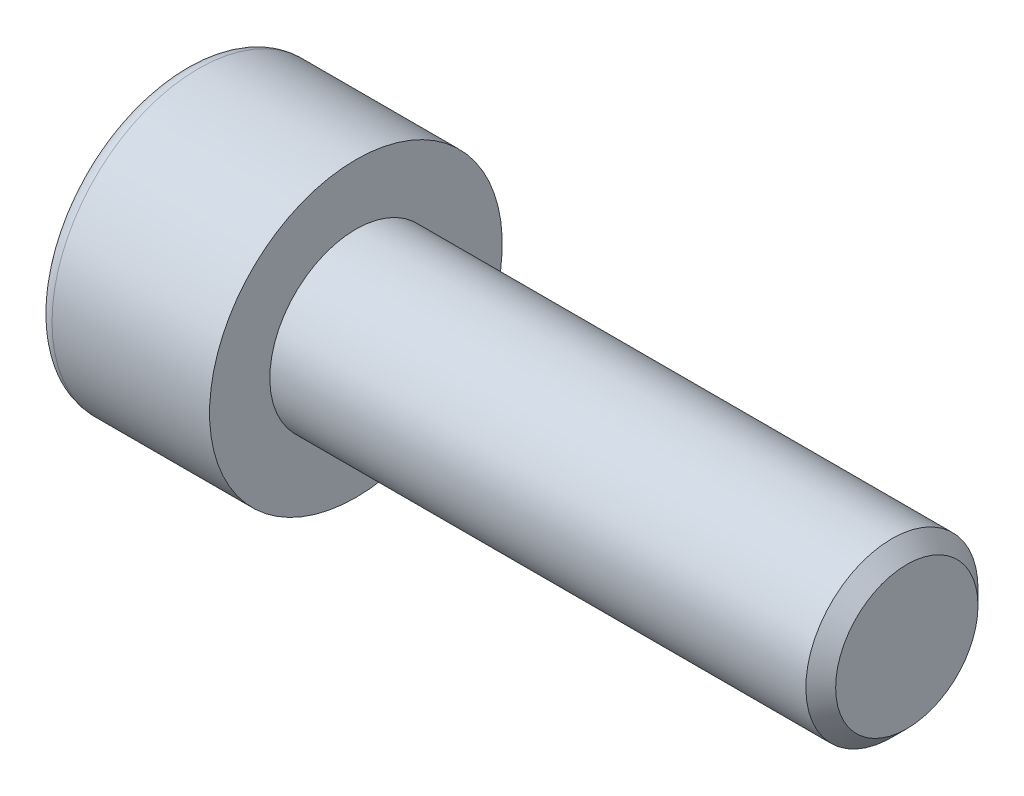
ISO-10303-21;
HEADER;
FILE_DESCRIPTION(('STEP AP214'),'2;1');
FILE_NAME('part.step','',(''),(''),'','','');
FILE_SCHEMA(('AUTOMOTIVE_DESIGN { 1 0 10303 214 1 1 1 1 }'));
ENDSEC;
DATA;
#1=APPLICATION_CONTEXT('core data for automotive mechanical design processes');
#2=APPLICATION_PROTOCOL_DEFINITION('international standard','automotive_design',2000,#1);
#3=PRODUCT_CONTEXT('',#1,'mechanical');
#4=PRODUCT('Part','Part','',(#3));
#5=PRODUCT_RELATED_PRODUCT_CATEGORY('part','',(#4));
#6=PRODUCT_DEFINITION_FORMATION('','',#4);
#7=PRODUCT_DEFINITION_CONTEXT('part definition',#1,'design');
#8=PRODUCT_DEFINITION('design','',#6,#7);
#9=PRODUCT_DEFINITION_SHAPE('','',#8);
#10=(LENGTH_UNIT() NAMED_UNIT(*) SI_UNIT(.MILLI.,.METRE.));
#11=(NAMED_UNIT(*) PLANE_ANGLE_UNIT() SI_UNIT($,.RADIAN.));
#12=(NAMED_UNIT(*) SI_UNIT($,.STERADIAN.) SOLID_ANGLE_UNIT());
#13=UNCERTAINTY_MEASURE_WITH_UNIT(LENGTH_MEASURE(1.E-05),#10,'distance_accuracy_value','');
#14=(GEOMETRIC_REPRESENTATION_CONTEXT(3) GLOBAL_UNCERTAINTY_ASSIGNED_CONTEXT((#13)) GLOBAL_UNIT_ASSIGNED_CONTEXT((#10,
#11,#12)) REPRESENTATION_CONTEXT('',''));
#15=CARTESIAN_POINT('',(0.,0.,0.));
#16=DIRECTION('',(0.,0.,1.));
#17=DIRECTION('',(1.,0.,0.));
#18=AXIS2_PLACEMENT_3D('',#15,#16,#17);
#19=CARTESIAN_POINT('',(-2.2875,0.,0.));
#20=DIRECTION('',(-1.,0.,0.));
#21=DIRECTION('',(0.,1.,0.));
#22=AXIS2_PLACEMENT_3D('',#19,#20,#21);
#23=CYLINDRICAL_SURFACE('',#22,4.25);
#24=CARTESIAN_POINT('',(-4.575,0.,0.));
#25=DIRECTION('',(-1.,0.,0.));
#26=DIRECTION('',(0.,0.,1.));
#27=AXIS2_PLACEMENT_3D('',#24,#25,#26);
#28=CIRCLE('',#27,4.25);
#29=CARTESIAN_POINT('',(-4.575,0.,4.25));
#30=VERTEX_POINT('',#29);
#31=EDGE_CURVE('E11',#30,#30,#28,.T.);
#32=ORIENTED_EDGE('',*,*,#31,.F.);
#33=EDGE_LOOP('',(#32));
#34=FACE_BOUND('',#33,.T.);
#35=CARTESIAN_POINT('',(0.,0.,0.));
#36=DIRECTION('',(1.,0.,0.));
#37=DIRECTION('',(0.,1.,0.));
#38=AXIS2_PLACEMENT_3D('',#35,#36,#37);
#39=CIRCLE('',#38,4.25);
#40=CARTESIAN_POINT('',(0.,4.25,0.));
#41=VERTEX_POINT('',#40);
#42=EDGE_CURVE('E99',#41,#41,#39,.T.);
#43=ORIENTED_EDGE('',*,*,#42,.F.);
#44=EDGE_LOOP('',(#43));
#45=FACE_BOUND('',#44,.T.);
#46=ADVANCED_FACE('F17',(#34,#45),#23,.T.);
#47=CARTESIAN_POINT('',(-4.575,0.,0.));
#48=DIRECTION('',(1.,0.,0.));
#49=DIRECTION('',(0.,0.,-1.));
#50=AXIS2_PLACEMENT_3D('',#47,#48,#49);
#51=TOROIDAL_SURFACE('',#50,3.825,0.425);
#52=CARTESIAN_POINT('',(-5.,0.,0.));
#53=DIRECTION('',(-1.,0.,0.));
#54=DIRECTION('',(0.,1.,0.));
#55=AXIS2_PLACEMENT_3D('',#52,#53,#54);
#56=CIRCLE('',#55,3.825);
#57=CARTESIAN_POINT('',(-5.,3.825,0.));
#58=VERTEX_POINT('',#57);
#59=EDGE_CURVE('E27',#58,#58,#56,.T.);
#60=ORIENTED_EDGE('',*,*,#59,.F.);
#61=EDGE_LOOP('',(#60));
#62=FACE_BOUND('',#61,.T.);
#63=ORIENTED_EDGE('',*,*,#31,.T.);
#64=EDGE_LOOP('',(#63));
#65=FACE_BOUND('',#64,.T.);
#66=ADVANCED_FACE('F120',(#62,#65),#51,.T.);
#67=CARTESIAN_POINT('',(-5.,1.9125,0.));
#68=DIRECTION('',(-1.,0.,0.));
#69=DIRECTION('',(0.,-1.,0.));
#70=AXIS2_PLACEMENT_3D('',#67,#68,#69);
#71=PLANE('',#70);
#72=ORIENTED_EDGE('',*,*,#59,.T.);
#73=EDGE_LOOP('',(#72));
#74=FACE_BOUND('',#73,.T.);
#75=DIRECTION('',(0.,0.500000000000017,-0.866025403784429));
#76=VECTOR('',#75,1.);
#77=CARTESIAN_POINT('',(-5.,-2.309401076758,0.));
#78=LINE('',#77,#76);
#79=CARTESIAN_POINT('',(-5.,-2.309401076758,0.));
#80=VERTEX_POINT('',#79);
#81=CARTESIAN_POINT('',(-5.,-1.154700538379,-2.));
#82=VERTEX_POINT('',#81);
#83=EDGE_CURVE('E170',#80,#82,#78,.T.);
#84=ORIENTED_EDGE('',*,*,#83,.T.);
#85=DIRECTION('',(0.,-1.,0.));
#86=VECTOR('',#85,1.);
#87=CARTESIAN_POINT('',(-5.,1.154700538379,-2.));
#88=LINE('',#87,#86);
#89=CARTESIAN_POINT('',(-5.,1.154700538379,-2.));
#90=VERTEX_POINT('',#89);
#91=EDGE_CURVE('E36',#90,#82,#88,.T.);
#92=ORIENTED_EDGE('',*,*,#91,.F.);
#93=DIRECTION('',(0.,0.500000000000017,0.866025403784429));
#94=VECTOR('',#93,1.);
#95=CARTESIAN_POINT('',(-5.,1.154700538379,-2.));
#96=LINE('',#95,#94);
#97=CARTESIAN_POINT('',(-5.,2.309401076758,0.));
#98=VERTEX_POINT('',#97);
#99=EDGE_CURVE('E172',#90,#98,#96,.T.);
#100=ORIENTED_EDGE('',*,*,#99,.T.);
#101=DIRECTION('',(0.,-0.500000000000017,0.866025403784429));
#102=VECTOR('',#101,1.);
#103=CARTESIAN_POINT('',(-5.,2.309401076758,0.));
#104=LINE('',#103,#102);
#105=CARTESIAN_POINT('',(-5.,1.154700538379,2.));
#106=VERTEX_POINT('',#105);
#107=EDGE_CURVE('E177',#98,#106,#104,.T.);
#108=ORIENTED_EDGE('',*,*,#107,.T.);
#109=DIRECTION('',(0.,1.,0.));
#110=VECTOR('',#109,1.);
#111=CARTESIAN_POINT('',(-5.,-1.154700538379,2.));
#112=LINE('',#111,#110);
#113=CARTESIAN_POINT('',(-5.,-1.154700538379,2.));
#114=VERTEX_POINT('',#113);
#115=EDGE_CURVE('E80',#114,#106,#112,.T.);
#116=ORIENTED_EDGE('',*,*,#115,.F.);
#117=DIRECTION('',(0.,-0.500000000000017,-0.866025403784429));
#118=VECTOR('',#117,1.);
#119=CARTESIAN_POINT('',(-5.,-1.154700538379,2.));
#120=LINE('',#119,#118);
#121=EDGE_CURVE('E179',#114,#80,#120,.T.);
#122=ORIENTED_EDGE('',*,*,#121,.T.);
#123=EDGE_LOOP('',(#84,#92,#100,#108,#116,#122));
#124=FACE_BOUND('',#123,.T.);
#125=ADVANCED_FACE('F126',(#74,#124),#71,.T.);
#126=CARTESIAN_POINT('',(-6.,-2.309401076758,0.));
#127=DIRECTION('',(0.,-0.866025403784429,0.500000000000017));
#128=DIRECTION('',(0.,-0.500000000000017,-0.866025403784429));
#129=AXIS2_PLACEMENT_3D('',#126,#127,#128);
#130=PLANE('',#129);
#131=DIRECTION('',(-1.,0.,0.));
#132=VECTOR('',#131,1.);
#133=CARTESIAN_POINT('',(-2.5,-1.154700538379,2.));
#134=LINE('',#133,#132);
#135=CARTESIAN_POINT('',(-2.5,-1.154700538379,2.));
#136=VERTEX_POINT('',#135);
#137=EDGE_CURVE('E93',#136,#114,#134,.T.);
#138=ORIENTED_EDGE('',*,*,#137,.F.);
#139=DIRECTION('',(0.,0.500000000000017,0.866025403784429));
#140=VECTOR('',#139,1.);
#141=CARTESIAN_POINT('',(-2.5,-2.309401076759,0.));
#142=LINE('',#141,#140);
#143=CARTESIAN_POINT('',(-2.5,-2.309401076759,0.));
#144=VERTEX_POINT('',#143);
#145=EDGE_CURVE('E91',#144,#136,#142,.T.);
#146=ORIENTED_EDGE('',*,*,#145,.F.);
#147=DIRECTION('',(-1.,0.,0.));
#148=VECTOR('',#147,1.);
#149=CARTESIAN_POINT('',(-2.5,-2.309401076759,0.));
#150=LINE('',#149,#148);
#151=EDGE_CURVE('E182',#144,#80,#150,.T.);
#152=ORIENTED_EDGE('',*,*,#151,.T.);
#153=ORIENTED_EDGE('',*,*,#121,.F.);
#154=EDGE_LOOP('',(#138,#146,#152,#153));
#155=FACE_BOUND('',#154,.T.);
#156=ADVANCED_FACE('F134',(#155),#130,.F.);
#157=CARTESIAN_POINT('',(-6.,-1.154700538379,-2.));
#158=DIRECTION('',(0.,-0.866025403784429,-0.500000000000017));
#159=DIRECTION('',(0.,0.500000000000017,-0.866025403784429));
#160=AXIS2_PLACEMENT_3D('',#157,#158,#159);
#161=PLANE('',#160);
#162=ORIENTED_EDGE('',*,*,#151,.F.);
#163=DIRECTION('',(0.,-0.500000000000017,0.866025403784429));
#164=VECTOR('',#163,1.);
#165=CARTESIAN_POINT('',(-2.5,-1.154700538379,-2.));
#166=LINE('',#165,#164);
#167=CARTESIAN_POINT('',(-2.5,-1.154700538379,-2.));
#168=VERTEX_POINT('',#167);
#169=EDGE_CURVE('E165',#168,#144,#166,.T.);
#170=ORIENTED_EDGE('',*,*,#169,.F.);
#171=DIRECTION('',(-1.,0.,0.));
#172=VECTOR('',#171,1.);
#173=CARTESIAN_POINT('',(-2.5,-1.154700538379,-2.));
#174=LINE('',#173,#172);
#175=EDGE_CURVE('E186',#168,#82,#174,.T.);
#176=ORIENTED_EDGE('',*,*,#175,.T.);
#177=ORIENTED_EDGE('',*,*,#83,.F.);
#178=EDGE_LOOP('',(#162,#170,#176,#177));
#179=FACE_BOUND('',#178,.T.);
#180=ADVANCED_FACE('F138',(#179),#161,.F.);
#181=CARTESIAN_POINT('',(-6.,1.154700538379,-2.));
#182=DIRECTION('',(0.,0.,-1.));
#183=DIRECTION('',(0.,1.,0.));
#184=AXIS2_PLACEMENT_3D('',#181,#182,#183);
#185=PLANE('',#184);
#186=ORIENTED_EDGE('',*,*,#175,.F.);
#187=DIRECTION('',(0.,1.,0.));
#188=VECTOR('',#187,1.);
#189=CARTESIAN_POINT('',(-2.5,-1.154700538379,-2.));
#190=LINE('',#189,#188);
#191=CARTESIAN_POINT('',(-2.5,1.154700538379,-2.));
#192=VERTEX_POINT('',#191);
#193=EDGE_CURVE('E190',#168,#192,#190,.T.);
#194=ORIENTED_EDGE('',*,*,#193,.T.);
#195=DIRECTION('',(-1.,0.,0.));
#196=VECTOR('',#195,1.);
#197=CARTESIAN_POINT('',(-2.5,1.154700538379,-2.));
#198=LINE('',#197,#196);
#199=EDGE_CURVE('E174',#192,#90,#198,.T.);
#200=ORIENTED_EDGE('',*,*,#199,.T.);
#201=ORIENTED_EDGE('',*,*,#91,.T.);
#202=EDGE_LOOP('',(#186,#194,#200,#201));
#203=FACE_BOUND('',#202,.T.);
#204=ADVANCED_FACE('F142',(#203),#185,.F.);
#205=CARTESIAN_POINT('',(-6.,2.309401076758,0.));
#206=DIRECTION('',(0.,0.866025403784429,-0.500000000000017));
#207=DIRECTION('',(0.,0.500000000000017,0.866025403784429));
#208=AXIS2_PLACEMENT_3D('',#205,#206,#207);
#209=PLANE('',#208);
#210=ORIENTED_EDGE('',*,*,#199,.F.);
#211=DIRECTION('',(0.,-0.500000000000017,-0.866025403784429));
#212=VECTOR('',#211,1.);
#213=CARTESIAN_POINT('',(-2.5,2.309401076759,0.));
#214=LINE('',#213,#212);
#215=CARTESIAN_POINT('',(-2.5,2.309401076759,0.));
#216=VERTEX_POINT('',#215);
#217=EDGE_CURVE('E67',#216,#192,#214,.T.);
#218=ORIENTED_EDGE('',*,*,#217,.F.);
#219=DIRECTION('',(-1.,0.,0.));
#220=VECTOR('',#219,1.);
#221=CARTESIAN_POINT('',(-2.5,2.309401076759,0.));
#222=LINE('',#221,#220);
#223=EDGE_CURVE('E77',#216,#98,#222,.T.);
#224=ORIENTED_EDGE('',*,*,#223,.T.);
#225=ORIENTED_EDGE('',*,*,#99,.F.);
#226=EDGE_LOOP('',(#210,#218,#224,#225));
#227=FACE_BOUND('',#226,.T.);
#228=ADVANCED_FACE('F146',(#227),#209,.F.);
#229=CARTESIAN_POINT('',(-6.,1.154700538379,2.));
#230=DIRECTION('',(0.,0.866025403784429,0.500000000000017));
#231=DIRECTION('',(0.,-0.500000000000017,0.866025403784429));
#232=AXIS2_PLACEMENT_3D('',#229,#230,#231);
#233=PLANE('',#232);
#234=ORIENTED_EDGE('',*,*,#223,.F.);
#235=DIRECTION('',(0.,0.500000000000017,-0.866025403784429));
#236=VECTOR('',#235,1.);
#237=CARTESIAN_POINT('',(-2.5,1.154700538379,2.));
#238=LINE('',#237,#236);
#239=CARTESIAN_POINT('',(-2.5,1.154700538379,2.));
#240=VERTEX_POINT('',#239);
#241=EDGE_CURVE('E73',#240,#216,#238,.T.);
#242=ORIENTED_EDGE('',*,*,#241,.F.);
#243=DIRECTION('',(-1.,0.,0.));
#244=VECTOR('',#243,1.);
#245=CARTESIAN_POINT('',(-2.5,1.154700538379,2.));
#246=LINE('',#245,#244);
#247=EDGE_CURVE('E76',#240,#106,#246,.T.);
#248=ORIENTED_EDGE('',*,*,#247,.T.);
#249=ORIENTED_EDGE('',*,*,#107,.F.);
#250=EDGE_LOOP('',(#234,#242,#248,#249));
#251=FACE_BOUND('',#250,.T.);
#252=ADVANCED_FACE('F75',(#251),#233,.F.);
#253=CARTESIAN_POINT('',(-6.,-1.154700538379,2.));
#254=DIRECTION('',(0.,0.,1.));
#255=DIRECTION('',(0.,-1.,0.));
#256=AXIS2_PLACEMENT_3D('',#253,#254,#255);
#257=PLANE('',#256);
#258=ORIENTED_EDGE('',*,*,#247,.F.);
#259=DIRECTION('',(0.,-1.,0.));
#260=VECTOR('',#259,1.);
#261=CARTESIAN_POINT('',(-2.5,1.154700538379,2.));
#262=LINE('',#261,#260);
#263=EDGE_CURVE('E86',#240,#136,#262,.T.);
#264=ORIENTED_EDGE('',*,*,#263,.T.);
#265=ORIENTED_EDGE('',*,*,#137,.T.);
#266=ORIENTED_EDGE('',*,*,#115,.T.);
#267=EDGE_LOOP('',(#258,#264,#265,#266));
#268=FACE_BOUND('',#267,.T.);
#269=ADVANCED_FACE('F84',(#268),#257,.F.);
#270=CARTESIAN_POINT('',(-2.5,0.,0.));
#271=DIRECTION('',(1.,0.,0.));
#272=DIRECTION('',(0.,0.,-1.));
#273=AXIS2_PLACEMENT_3D('',#270,#271,#272);
#274=PLANE('',#273);
#275=ORIENTED_EDGE('',*,*,#263,.F.);
#276=ORIENTED_EDGE('',*,*,#241,.T.);
#277=ORIENTED_EDGE('',*,*,#217,.T.);
#278=ORIENTED_EDGE('',*,*,#193,.F.);
#279=ORIENTED_EDGE('',*,*,#169,.T.);
#280=ORIENTED_EDGE('',*,*,#145,.T.);
#281=EDGE_LOOP('',(#275,#276,#277,#278,#279,#280));
#282=FACE_BOUND('',#281,.T.);
#283=ADVANCED_FACE('F89',(#282),#274,.F.);
#284=CARTESIAN_POINT('',(0.,2.125,0.));
#285=DIRECTION('',(1.,0.,0.));
#286=DIRECTION('',(0.,1.,0.));
#287=AXIS2_PLACEMENT_3D('',#284,#285,#286);
#288=PLANE('',#287);
#289=ORIENTED_EDGE('',*,*,#42,.T.);
#290=EDGE_LOOP('',(#289));
#291=FACE_BOUND('',#290,.T.);
#292=CARTESIAN_POINT('',(0.,0.,0.));
#293=DIRECTION('',(-1.,0.,0.));
#294=DIRECTION('',(0.,1.,0.));
#295=AXIS2_PLACEMENT_3D('',#292,#293,#294);
#296=CIRCLE('',#295,2.5);
#297=CARTESIAN_POINT('',(0.,2.5,0.));
#298=VERTEX_POINT('',#297);
#299=EDGE_CURVE('E97',#298,#298,#296,.T.);
#300=ORIENTED_EDGE('',*,*,#299,.T.);
#301=EDGE_LOOP('',(#300));
#302=FACE_BOUND('',#301,.T.);
#303=ADVANCED_FACE('F116',(#291,#302),#288,.T.);
#304=CARTESIAN_POINT('',(7.5335,0.,0.));
#305=DIRECTION('',(-1.,0.,0.));
#306=DIRECTION('',(0.,1.,0.));
#307=AXIS2_PLACEMENT_3D('',#304,#305,#306);
#308=CYLINDRICAL_SURFACE('',#307,2.5);
#309=ORIENTED_EDGE('',*,*,#299,.F.);
#310=EDGE_LOOP('',(#309));
#311=FACE_BOUND('',#310,.T.);
#312=CARTESIAN_POINT('',(15.567,0.,0.));
#313=DIRECTION('',(1.,0.,0.));
#314=DIRECTION('',(0.,1.,0.));
#315=AXIS2_PLACEMENT_3D('',#312,#313,#314);
#316=CIRCLE('',#315,2.5);
#317=CARTESIAN_POINT('',(15.567,2.5,0.));
#318=VERTEX_POINT('',#317);
#319=EDGE_CURVE('E100',#318,#318,#316,.T.);
#320=ORIENTED_EDGE('',*,*,#319,.F.);
#321=EDGE_LOOP('',(#320));
#322=FACE_BOUND('',#321,.T.);
#323=ADVANCED_FACE('F110',(#311,#322),#308,.T.);
#324=CARTESIAN_POINT('',(15.7835,0.,0.));
#325=DIRECTION('',(-1.,0.,0.));
#326=DIRECTION('',(0.,1.,0.));
#327=AXIS2_PLACEMENT_3D('',#324,#325,#326);
#328=CONICAL_SURFACE('',#327,2.2835,0.7853981633973);
#329=ORIENTED_EDGE('',*,*,#319,.T.);
#330=EDGE_LOOP('',(#329));
#331=FACE_BOUND('',#330,.T.);
#332=CARTESIAN_POINT('',(16.,0.,0.));
#333=DIRECTION('',(1.,0.,0.));
#334=DIRECTION('',(0.,-1.,0.));
#335=AXIS2_PLACEMENT_3D('',#332,#333,#334);
#336=CIRCLE('',#335,2.067);
#337=CARTESIAN_POINT('',(16.,-2.067,0.));
#338=VERTEX_POINT('',#337);
#339=EDGE_CURVE('E21',#338,#338,#336,.T.);
#340=ORIENTED_EDGE('',*,*,#339,.F.);
#341=EDGE_LOOP('',(#340));
#342=FACE_BOUND('',#341,.T.);
#343=ADVANCED_FACE('F108',(#331,#342),#328,.T.);
#344=CARTESIAN_POINT('',(16.,1.0335,0.));
#345=DIRECTION('',(1.,0.,0.));
#346=DIRECTION('',(0.,1.,0.));
#347=AXIS2_PLACEMENT_3D('',#344,#345,#346);
#348=PLANE('',#347);
#349=ORIENTED_EDGE('',*,*,#339,.T.);
#350=EDGE_LOOP('',(#349));
#351=FACE_BOUND('',#350,.T.);
#352=ADVANCED_FACE('F19',(#351),#348,.T.);
#353=CLOSED_SHELL('',(#46,#66,#125,#156,#180,#204,#228,#252,#269,#283,#303,#323,#343,#352));
#354=MANIFOLD_SOLID_BREP('B1',#353);
#355=ADVANCED_BREP_SHAPE_REPRESENTATION('',(#18,#354),#14);
#356=SHAPE_DEFINITION_REPRESENTATION(#9,#355);
ENDSEC;
END-ISO-10303-21;
